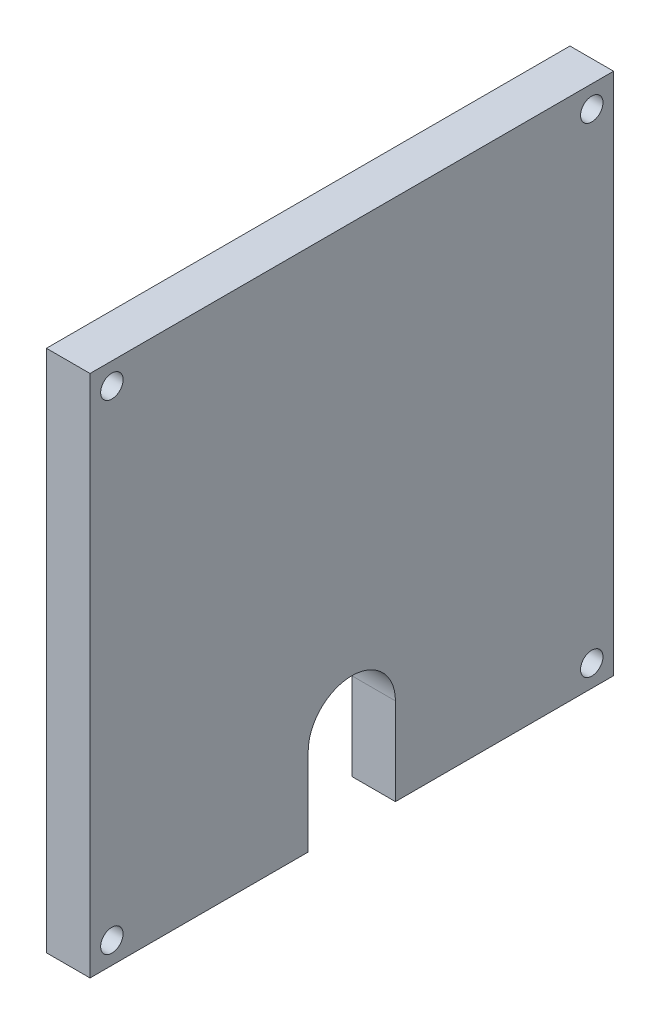
ISO-10303-21;
HEADER;
FILE_DESCRIPTION(('STEP AP214'),'2;1');
FILE_NAME('part.step','',(''),(''),'','','');
FILE_SCHEMA(('AUTOMOTIVE_DESIGN { 1 0 10303 214 1 1 1 1 }'));
ENDSEC;
DATA;
#1=APPLICATION_CONTEXT('core data for automotive mechanical design processes');
#2=APPLICATION_PROTOCOL_DEFINITION('international standard','automotive_design',2000,#1);
#3=PRODUCT_CONTEXT('',#1,'mechanical');
#4=PRODUCT('Part','Part','',(#3));
#5=PRODUCT_RELATED_PRODUCT_CATEGORY('part','',(#4));
#6=PRODUCT_DEFINITION_FORMATION('','',#4);
#7=PRODUCT_DEFINITION_CONTEXT('part definition',#1,'design');
#8=PRODUCT_DEFINITION('design','',#6,#7);
#9=PRODUCT_DEFINITION_SHAPE('','',#8);
#10=(LENGTH_UNIT() NAMED_UNIT(*) SI_UNIT(.MILLI.,.METRE.));
#11=(NAMED_UNIT(*) PLANE_ANGLE_UNIT() SI_UNIT($,.RADIAN.));
#12=(NAMED_UNIT(*) SI_UNIT($,.STERADIAN.) SOLID_ANGLE_UNIT());
#13=UNCERTAINTY_MEASURE_WITH_UNIT(LENGTH_MEASURE(1.E-05),#10,'distance_accuracy_value','');
#14=(GEOMETRIC_REPRESENTATION_CONTEXT(3) GLOBAL_UNCERTAINTY_ASSIGNED_CONTEXT((#13)) GLOBAL_UNIT_ASSIGNED_CONTEXT((#10,
#11,#12)) REPRESENTATION_CONTEXT('',''));
#15=CARTESIAN_POINT('',(0.,0.,0.));
#16=DIRECTION('',(0.,0.,1.));
#17=DIRECTION('',(1.,0.,0.));
#18=AXIS2_PLACEMENT_3D('',#15,#16,#17);
#19=CARTESIAN_POINT('',(6.35,-38.1,38.1));
#20=DIRECTION('',(0.,1.,0.));
#21=DIRECTION('',(0.,0.,1.));
#22=AXIS2_PLACEMENT_3D('',#19,#20,#21);
#23=PLANE('',#22);
#24=DIRECTION('',(0.,0.,-1.));
#25=VECTOR('',#24,1.);
#26=CARTESIAN_POINT('',(0.,-38.1,38.1));
#27=LINE('',#26,#25);
#28=CARTESIAN_POINT('',(0.,-38.1,38.1));
#29=VERTEX_POINT('',#28);
#30=CARTESIAN_POINT('',(0.,-38.1,6.34999999999999));
#31=VERTEX_POINT('',#30);
#32=EDGE_CURVE('E237',#29,#31,#27,.T.);
#33=ORIENTED_EDGE('',*,*,#32,.T.);
#34=DIRECTION('',(1.,0.,0.));
#35=VECTOR('',#34,1.);
#36=CARTESIAN_POINT('',(6.35,-38.1,6.34999999999999));
#37=LINE('',#36,#35);
#38=CARTESIAN_POINT('',(6.35,-38.1,6.34999999999999));
#39=VERTEX_POINT('',#38);
#40=EDGE_CURVE('E208',#31,#39,#37,.T.);
#41=ORIENTED_EDGE('',*,*,#40,.T.);
#42=DIRECTION('',(0.,0.,-1.));
#43=VECTOR('',#42,1.);
#44=CARTESIAN_POINT('',(6.35,-38.1,38.1));
#45=LINE('',#44,#43);
#46=CARTESIAN_POINT('',(6.35,-38.1,38.1));
#47=VERTEX_POINT('',#46);
#48=EDGE_CURVE('E199',#47,#39,#45,.T.);
#49=ORIENTED_EDGE('',*,*,#48,.F.);
#50=DIRECTION('',(-1.,0.,0.));
#51=VECTOR('',#50,1.);
#52=CARTESIAN_POINT('',(6.35,-38.1,38.1));
#53=LINE('',#52,#51);
#54=EDGE_CURVE('E252',#47,#29,#53,.T.);
#55=ORIENTED_EDGE('',*,*,#54,.T.);
#56=EDGE_LOOP('',(#33,#41,#49,#55));
#57=FACE_BOUND('',#56,.T.);
#58=ADVANCED_FACE('F107',(#57),#23,.F.);
#59=CARTESIAN_POINT('',(6.35,0.,0.));
#60=DIRECTION('',(-1.,0.,0.));
#61=DIRECTION('',(0.,0.,1.));
#62=AXIS2_PLACEMENT_3D('',#59,#60,#61);
#63=PLANE('',#62);
#64=CARTESIAN_POINT('',(6.35,34.925,34.925));
#65=DIRECTION('',(1.,0.,0.));
#66=DIRECTION('',(0.,0.,-1.));
#67=AXIS2_PLACEMENT_3D('',#64,#65,#66);
#68=CIRCLE('',#67,1.63194999999999);
#69=CARTESIAN_POINT('',(6.35,34.925,33.29305));
#70=VERTEX_POINT('',#69);
#71=EDGE_CURVE('E228',#70,#70,#68,.T.);
#72=ORIENTED_EDGE('',*,*,#71,.F.);
#73=EDGE_LOOP('',(#72));
#74=FACE_BOUND('',#73,.T.);
#75=CARTESIAN_POINT('',(6.35,34.925,-34.925));
#76=DIRECTION('',(1.,0.,0.));
#77=DIRECTION('',(0.,0.,-1.));
#78=AXIS2_PLACEMENT_3D('',#75,#76,#77);
#79=CIRCLE('',#78,1.63194999999999);
#80=CARTESIAN_POINT('',(6.35,34.925,-36.55695));
#81=VERTEX_POINT('',#80);
#82=EDGE_CURVE('E222',#81,#81,#79,.T.);
#83=ORIENTED_EDGE('',*,*,#82,.F.);
#84=EDGE_LOOP('',(#83));
#85=FACE_BOUND('',#84,.T.);
#86=CARTESIAN_POINT('',(6.35,-34.925,-34.925));
#87=DIRECTION('',(1.,0.,0.));
#88=DIRECTION('',(0.,0.,-1.));
#89=AXIS2_PLACEMENT_3D('',#86,#87,#88);
#90=CIRCLE('',#89,1.63194999999999);
#91=CARTESIAN_POINT('',(6.35,-34.925,-36.55695));
#92=VERTEX_POINT('',#91);
#93=EDGE_CURVE('E216',#92,#92,#90,.T.);
#94=ORIENTED_EDGE('',*,*,#93,.F.);
#95=EDGE_LOOP('',(#94));
#96=FACE_BOUND('',#95,.T.);
#97=CARTESIAN_POINT('',(6.35,-34.925,34.925));
#98=DIRECTION('',(1.,0.,0.));
#99=DIRECTION('',(0.,0.,-1.));
#100=AXIS2_PLACEMENT_3D('',#97,#98,#99);
#101=CIRCLE('',#100,1.63194999999999);
#102=CARTESIAN_POINT('',(6.35,-34.925,33.29305));
#103=VERTEX_POINT('',#102);
#104=EDGE_CURVE('E210',#103,#103,#101,.T.);
#105=ORIENTED_EDGE('',*,*,#104,.F.);
#106=EDGE_LOOP('',(#105));
#107=FACE_BOUND('',#106,.T.);
#108=DIRECTION('',(0.,1.,0.));
#109=VECTOR('',#108,1.);
#110=CARTESIAN_POINT('',(6.35,-50.8,-6.35000000000002));
#111=LINE('',#110,#109);
#112=CARTESIAN_POINT('',(6.35,-38.1,-6.35000000000002));
#113=VERTEX_POINT('',#112);
#114=CARTESIAN_POINT('',(6.35,-25.4,-6.35000000000002));
#115=VERTEX_POINT('',#114);
#116=EDGE_CURVE('E200',#113,#115,#111,.T.);
#117=ORIENTED_EDGE('',*,*,#116,.F.);
#118=CARTESIAN_POINT('',(6.35,-38.1,-38.1));
#119=VERTEX_POINT('',#118);
#120=EDGE_CURVE('E131',#113,#119,#45,.T.);
#121=ORIENTED_EDGE('',*,*,#120,.T.);
#122=DIRECTION('',(0.,1.,0.));
#123=VECTOR('',#122,1.);
#124=CARTESIAN_POINT('',(6.35,-38.1,-38.1));
#125=LINE('',#124,#123);
#126=CARTESIAN_POINT('',(6.35,38.1,-38.1));
#127=VERTEX_POINT('',#126);
#128=EDGE_CURVE('E235',#119,#127,#125,.T.);
#129=ORIENTED_EDGE('',*,*,#128,.T.);
#130=DIRECTION('',(0.,0.,1.));
#131=VECTOR('',#130,1.);
#132=CARTESIAN_POINT('',(6.35,38.1,38.1));
#133=LINE('',#132,#131);
#134=CARTESIAN_POINT('',(6.35,38.1,38.1));
#135=VERTEX_POINT('',#134);
#136=EDGE_CURVE('E161',#127,#135,#133,.T.);
#137=ORIENTED_EDGE('',*,*,#136,.T.);
#138=DIRECTION('',(0.,-1.,0.));
#139=VECTOR('',#138,1.);
#140=CARTESIAN_POINT('',(6.35,-38.1,38.1));
#141=LINE('',#140,#139);
#142=EDGE_CURVE('E239',#135,#47,#141,.T.);
#143=ORIENTED_EDGE('',*,*,#142,.T.);
#144=ORIENTED_EDGE('',*,*,#48,.T.);
#145=DIRECTION('',(0.,1.,0.));
#146=VECTOR('',#145,1.);
#147=CARTESIAN_POINT('',(6.35,-50.8,6.34999999999999));
#148=LINE('',#147,#146);
#149=CARTESIAN_POINT('',(6.35,-25.4,6.34999999999999));
#150=VERTEX_POINT('',#149);
#151=EDGE_CURVE('E185',#39,#150,#148,.T.);
#152=ORIENTED_EDGE('',*,*,#151,.T.);
#153=CARTESIAN_POINT('',(6.35,-25.4,0.));
#154=DIRECTION('',(1.,0.,0.));
#155=DIRECTION('',(0.,0.,-1.));
#156=AXIS2_PLACEMENT_3D('',#153,#154,#155);
#157=CIRCLE('',#156,6.35);
#158=EDGE_CURVE('E193',#115,#150,#157,.T.);
#159=ORIENTED_EDGE('',*,*,#158,.F.);
#160=EDGE_LOOP('',(#117,#121,#129,#137,#143,#144,#152,#159));
#161=FACE_BOUND('',#160,.T.);
#162=ADVANCED_FACE('F197',(#74,#85,#96,#107,#161),#63,.F.);
#163=CARTESIAN_POINT('',(6.35,-38.1,-38.1));
#164=DIRECTION('',(0.,0.,1.));
#165=DIRECTION('',(1.,0.,0.));
#166=AXIS2_PLACEMENT_3D('',#163,#164,#165);
#167=PLANE('',#166);
#168=DIRECTION('',(0.,1.,0.));
#169=VECTOR('',#168,1.);
#170=CARTESIAN_POINT('',(0.,-38.1,-38.1));
#171=LINE('',#170,#169);
#172=CARTESIAN_POINT('',(0.,-38.1,-38.1));
#173=VERTEX_POINT('',#172);
#174=CARTESIAN_POINT('',(0.,38.1,-38.1));
#175=VERTEX_POINT('',#174);
#176=EDGE_CURVE('E234',#173,#175,#171,.T.);
#177=ORIENTED_EDGE('',*,*,#176,.T.);
#178=DIRECTION('',(-1.,0.,0.));
#179=VECTOR('',#178,1.);
#180=CARTESIAN_POINT('',(6.35,38.1,-38.1));
#181=LINE('',#180,#179);
#182=EDGE_CURVE('E258',#127,#175,#181,.T.);
#183=ORIENTED_EDGE('',*,*,#182,.F.);
#184=ORIENTED_EDGE('',*,*,#128,.F.);
#185=DIRECTION('',(-1.,0.,0.));
#186=VECTOR('',#185,1.);
#187=CARTESIAN_POINT('',(6.35,-38.1,-38.1));
#188=LINE('',#187,#186);
#189=EDGE_CURVE('E242',#119,#173,#188,.T.);
#190=ORIENTED_EDGE('',*,*,#189,.T.);
#191=EDGE_LOOP('',(#177,#183,#184,#190));
#192=FACE_BOUND('',#191,.T.);
#193=ADVANCED_FACE('F109',(#192),#167,.F.);
#194=CARTESIAN_POINT('',(6.35,38.1,38.1));
#195=DIRECTION('',(0.,-1.,0.));
#196=DIRECTION('',(0.,0.,-1.));
#197=AXIS2_PLACEMENT_3D('',#194,#195,#196);
#198=PLANE('',#197);
#199=DIRECTION('',(0.,0.,1.));
#200=VECTOR('',#199,1.);
#201=CARTESIAN_POINT('',(0.,38.1,38.1));
#202=LINE('',#201,#200);
#203=CARTESIAN_POINT('',(0.,38.1,38.1));
#204=VERTEX_POINT('',#203);
#205=EDGE_CURVE('E245',#175,#204,#202,.T.);
#206=ORIENTED_EDGE('',*,*,#205,.T.);
#207=DIRECTION('',(-1.,0.,0.));
#208=VECTOR('',#207,1.);
#209=CARTESIAN_POINT('',(6.35,38.1,38.1));
#210=LINE('',#209,#208);
#211=EDGE_CURVE('E255',#135,#204,#210,.T.);
#212=ORIENTED_EDGE('',*,*,#211,.F.);
#213=ORIENTED_EDGE('',*,*,#136,.F.);
#214=ORIENTED_EDGE('',*,*,#182,.T.);
#215=EDGE_LOOP('',(#206,#212,#213,#214));
#216=FACE_BOUND('',#215,.T.);
#217=ADVANCED_FACE('F272',(#216),#198,.F.);
#218=CARTESIAN_POINT('',(6.35,-38.1,38.1));
#219=DIRECTION('',(0.,0.,-1.));
#220=DIRECTION('',(-1.,0.,0.));
#221=AXIS2_PLACEMENT_3D('',#218,#219,#220);
#222=PLANE('',#221);
#223=DIRECTION('',(0.,-1.,0.));
#224=VECTOR('',#223,1.);
#225=CARTESIAN_POINT('',(0.,-38.1,38.1));
#226=LINE('',#225,#224);
#227=EDGE_CURVE('E247',#204,#29,#226,.T.);
#228=ORIENTED_EDGE('',*,*,#227,.T.);
#229=ORIENTED_EDGE('',*,*,#54,.F.);
#230=ORIENTED_EDGE('',*,*,#142,.F.);
#231=ORIENTED_EDGE('',*,*,#211,.T.);
#232=EDGE_LOOP('',(#228,#229,#230,#231));
#233=FACE_BOUND('',#232,.T.);
#234=ADVANCED_FACE('F274',(#233),#222,.F.);
#235=ORIENTED_EDGE('',*,*,#120,.F.);
#236=DIRECTION('',(-1.,0.,0.));
#237=VECTOR('',#236,1.);
#238=CARTESIAN_POINT('',(6.35,-38.1,-6.35000000000001));
#239=LINE('',#238,#237);
#240=CARTESIAN_POINT('',(0.,-38.1,-6.35));
#241=VERTEX_POINT('',#240);
#242=EDGE_CURVE('E206',#113,#241,#239,.T.);
#243=ORIENTED_EDGE('',*,*,#242,.T.);
#244=EDGE_CURVE('E153',#241,#173,#27,.T.);
#245=ORIENTED_EDGE('',*,*,#244,.T.);
#246=ORIENTED_EDGE('',*,*,#189,.F.);
#247=EDGE_LOOP('',(#235,#243,#245,#246));
#248=FACE_BOUND('',#247,.T.);
#249=ADVANCED_FACE('F262',(#248),#23,.F.);
#250=CARTESIAN_POINT('',(0.,0.,0.));
#251=DIRECTION('',(-1.,0.,0.));
#252=DIRECTION('',(0.,0.,1.));
#253=AXIS2_PLACEMENT_3D('',#250,#251,#252);
#254=PLANE('',#253);
#255=DIRECTION('',(0.,1.,0.));
#256=VECTOR('',#255,1.);
#257=CARTESIAN_POINT('',(0.,0.,6.34999999999999));
#258=LINE('',#257,#256);
#259=CARTESIAN_POINT('',(0.,-25.4,6.34999999999999));
#260=VERTEX_POINT('',#259);
#261=EDGE_CURVE('E13',#31,#260,#258,.T.);
#262=ORIENTED_EDGE('',*,*,#261,.F.);
#263=ORIENTED_EDGE('',*,*,#32,.F.);
#264=ORIENTED_EDGE('',*,*,#227,.F.);
#265=ORIENTED_EDGE('',*,*,#205,.F.);
#266=ORIENTED_EDGE('',*,*,#176,.F.);
#267=ORIENTED_EDGE('',*,*,#244,.F.);
#268=DIRECTION('',(0.,-1.,0.));
#269=VECTOR('',#268,1.);
#270=CARTESIAN_POINT('',(0.,0.,-6.35000000000001));
#271=LINE('',#270,#269);
#272=CARTESIAN_POINT('',(0.,-25.4,-6.35000000000001));
#273=VERTEX_POINT('',#272);
#274=EDGE_CURVE('E115',#273,#241,#271,.T.);
#275=ORIENTED_EDGE('',*,*,#274,.F.);
#276=CARTESIAN_POINT('',(0.,-25.4,0.));
#277=DIRECTION('',(1.,0.,0.));
#278=DIRECTION('',(0.,0.,-1.));
#279=AXIS2_PLACEMENT_3D('',#276,#277,#278);
#280=CIRCLE('',#279,6.34999999999999);
#281=EDGE_CURVE('E190',#273,#260,#280,.T.);
#282=ORIENTED_EDGE('',*,*,#281,.T.);
#283=EDGE_LOOP('',(#262,#263,#264,#265,#266,#267,#275,#282));
#284=FACE_BOUND('',#283,.T.);
#285=CARTESIAN_POINT('',(0.,-34.925,34.925));
#286=DIRECTION('',(1.,0.,0.));
#287=DIRECTION('',(0.,0.,-1.));
#288=AXIS2_PLACEMENT_3D('',#285,#286,#287);
#289=CIRCLE('',#288,1.63195);
#290=CARTESIAN_POINT('',(0.,-34.925,33.29305));
#291=VERTEX_POINT('',#290);
#292=EDGE_CURVE('E213',#291,#291,#289,.T.);
#293=ORIENTED_EDGE('',*,*,#292,.T.);
#294=EDGE_LOOP('',(#293));
#295=FACE_BOUND('',#294,.T.);
#296=CARTESIAN_POINT('',(0.,-34.925,-34.925));
#297=DIRECTION('',(1.,0.,0.));
#298=DIRECTION('',(0.,0.,-1.));
#299=AXIS2_PLACEMENT_3D('',#296,#297,#298);
#300=CIRCLE('',#299,1.63195);
#301=CARTESIAN_POINT('',(0.,-34.925,-36.55695));
#302=VERTEX_POINT('',#301);
#303=EDGE_CURVE('E219',#302,#302,#300,.T.);
#304=ORIENTED_EDGE('',*,*,#303,.T.);
#305=EDGE_LOOP('',(#304));
#306=FACE_BOUND('',#305,.T.);
#307=CARTESIAN_POINT('',(0.,34.925,-34.925));
#308=DIRECTION('',(1.,0.,0.));
#309=DIRECTION('',(0.,0.,-1.));
#310=AXIS2_PLACEMENT_3D('',#307,#308,#309);
#311=CIRCLE('',#310,1.63195);
#312=CARTESIAN_POINT('',(0.,34.925,-36.55695));
#313=VERTEX_POINT('',#312);
#314=EDGE_CURVE('E225',#313,#313,#311,.T.);
#315=ORIENTED_EDGE('',*,*,#314,.T.);
#316=EDGE_LOOP('',(#315));
#317=FACE_BOUND('',#316,.T.);
#318=CARTESIAN_POINT('',(0.,34.925,34.925));
#319=DIRECTION('',(1.,0.,0.));
#320=DIRECTION('',(0.,0.,-1.));
#321=AXIS2_PLACEMENT_3D('',#318,#319,#320);
#322=CIRCLE('',#321,1.63195);
#323=CARTESIAN_POINT('',(0.,34.925,33.29305));
#324=VERTEX_POINT('',#323);
#325=EDGE_CURVE('E231',#324,#324,#322,.T.);
#326=ORIENTED_EDGE('',*,*,#325,.T.);
#327=EDGE_LOOP('',(#326));
#328=FACE_BOUND('',#327,.T.);
#329=ADVANCED_FACE('F264',(#284,#295,#306,#317,#328),#254,.T.);
#330=CARTESIAN_POINT('',(6.35,34.925,34.925));
#331=DIRECTION('',(1.,0.,0.));
#332=DIRECTION('',(0.,0.,-1.));
#333=AXIS2_PLACEMENT_3D('',#330,#331,#332);
#334=CYLINDRICAL_SURFACE('',#333,1.63194999999999);
#335=ORIENTED_EDGE('',*,*,#325,.F.);
#336=EDGE_LOOP('',(#335));
#337=FACE_BOUND('',#336,.T.);
#338=ORIENTED_EDGE('',*,*,#71,.T.);
#339=EDGE_LOOP('',(#338));
#340=FACE_BOUND('',#339,.T.);
#341=ADVANCED_FACE('F291',(#337,#340),#334,.F.);
#342=CARTESIAN_POINT('',(6.35,34.925,-34.925));
#343=DIRECTION('',(1.,0.,0.));
#344=DIRECTION('',(0.,0.,-1.));
#345=AXIS2_PLACEMENT_3D('',#342,#343,#344);
#346=CYLINDRICAL_SURFACE('',#345,1.63194999999999);
#347=ORIENTED_EDGE('',*,*,#314,.F.);
#348=EDGE_LOOP('',(#347));
#349=FACE_BOUND('',#348,.T.);
#350=ORIENTED_EDGE('',*,*,#82,.T.);
#351=EDGE_LOOP('',(#350));
#352=FACE_BOUND('',#351,.T.);
#353=ADVANCED_FACE('F319',(#349,#352),#346,.F.);
#354=CARTESIAN_POINT('',(6.35,-34.925,-34.925));
#355=DIRECTION('',(1.,0.,0.));
#356=DIRECTION('',(0.,0.,-1.));
#357=AXIS2_PLACEMENT_3D('',#354,#355,#356);
#358=CYLINDRICAL_SURFACE('',#357,1.63194999999999);
#359=ORIENTED_EDGE('',*,*,#303,.F.);
#360=EDGE_LOOP('',(#359));
#361=FACE_BOUND('',#360,.T.);
#362=ORIENTED_EDGE('',*,*,#93,.T.);
#363=EDGE_LOOP('',(#362));
#364=FACE_BOUND('',#363,.T.);
#365=ADVANCED_FACE('F331',(#361,#364),#358,.F.);
#366=CARTESIAN_POINT('',(6.35,-34.925,34.925));
#367=DIRECTION('',(1.,0.,0.));
#368=DIRECTION('',(0.,0.,-1.));
#369=AXIS2_PLACEMENT_3D('',#366,#367,#368);
#370=CYLINDRICAL_SURFACE('',#369,1.63194999999999);
#371=ORIENTED_EDGE('',*,*,#292,.F.);
#372=EDGE_LOOP('',(#371));
#373=FACE_BOUND('',#372,.T.);
#374=ORIENTED_EDGE('',*,*,#104,.T.);
#375=EDGE_LOOP('',(#374));
#376=FACE_BOUND('',#375,.T.);
#377=ADVANCED_FACE('F340',(#373,#376),#370,.F.);
#378=CARTESIAN_POINT('',(6.35,-50.8,6.34999999999999));
#379=DIRECTION('',(0.,0.,1.));
#380=DIRECTION('',(1.,0.,0.));
#381=AXIS2_PLACEMENT_3D('',#378,#379,#380);
#382=PLANE('',#381);
#383=ORIENTED_EDGE('',*,*,#261,.T.);
#384=DIRECTION('',(1.,0.,0.));
#385=VECTOR('',#384,1.);
#386=CARTESIAN_POINT('',(6.35,-25.4,6.34999999999999));
#387=LINE('',#386,#385);
#388=EDGE_CURVE('E181',#260,#150,#387,.T.);
#389=ORIENTED_EDGE('',*,*,#388,.T.);
#390=ORIENTED_EDGE('',*,*,#151,.F.);
#391=ORIENTED_EDGE('',*,*,#40,.F.);
#392=EDGE_LOOP('',(#383,#389,#390,#391));
#393=FACE_BOUND('',#392,.T.);
#394=ADVANCED_FACE('F183',(#393),#382,.F.);
#395=CARTESIAN_POINT('',(6.35,-50.8,-6.35000000000001));
#396=DIRECTION('',(0.,0.,-1.));
#397=DIRECTION('',(-1.,0.,0.));
#398=AXIS2_PLACEMENT_3D('',#395,#396,#397);
#399=PLANE('',#398);
#400=ORIENTED_EDGE('',*,*,#116,.T.);
#401=DIRECTION('',(1.,0.,0.));
#402=VECTOR('',#401,1.);
#403=CARTESIAN_POINT('',(6.35,-25.4,-6.35000000000001));
#404=LINE('',#403,#402);
#405=EDGE_CURVE('E122',#115,#273,#404,.F.);
#406=ORIENTED_EDGE('',*,*,#405,.T.);
#407=ORIENTED_EDGE('',*,*,#274,.T.);
#408=ORIENTED_EDGE('',*,*,#242,.F.);
#409=EDGE_LOOP('',(#400,#406,#407,#408));
#410=FACE_BOUND('',#409,.T.);
#411=ADVANCED_FACE('F260',(#410),#399,.F.);
#412=CARTESIAN_POINT('',(6.35,-25.4,0.));
#413=DIRECTION('',(1.,0.,0.));
#414=DIRECTION('',(0.,0.,-1.));
#415=AXIS2_PLACEMENT_3D('',#412,#413,#414);
#416=CYLINDRICAL_SURFACE('',#415,6.35);
#417=ORIENTED_EDGE('',*,*,#281,.F.);
#418=ORIENTED_EDGE('',*,*,#405,.F.);
#419=ORIENTED_EDGE('',*,*,#158,.T.);
#420=ORIENTED_EDGE('',*,*,#388,.F.);
#421=EDGE_LOOP('',(#417,#418,#419,#420));
#422=FACE_BOUND('',#421,.T.);
#423=ADVANCED_FACE('F194',(#422),#416,.F.);
#424=CLOSED_SHELL('',(#58,#162,#193,#217,#234,#249,#329,#341,#353,#365,#377,#394,#411,#423));
#425=MANIFOLD_SOLID_BREP('B2',#424);
#426=ADVANCED_BREP_SHAPE_REPRESENTATION('',(#18,#425),#14);
#427=SHAPE_DEFINITION_REPRESENTATION(#9,#426);
ENDSEC;
END-ISO-10303-21;
